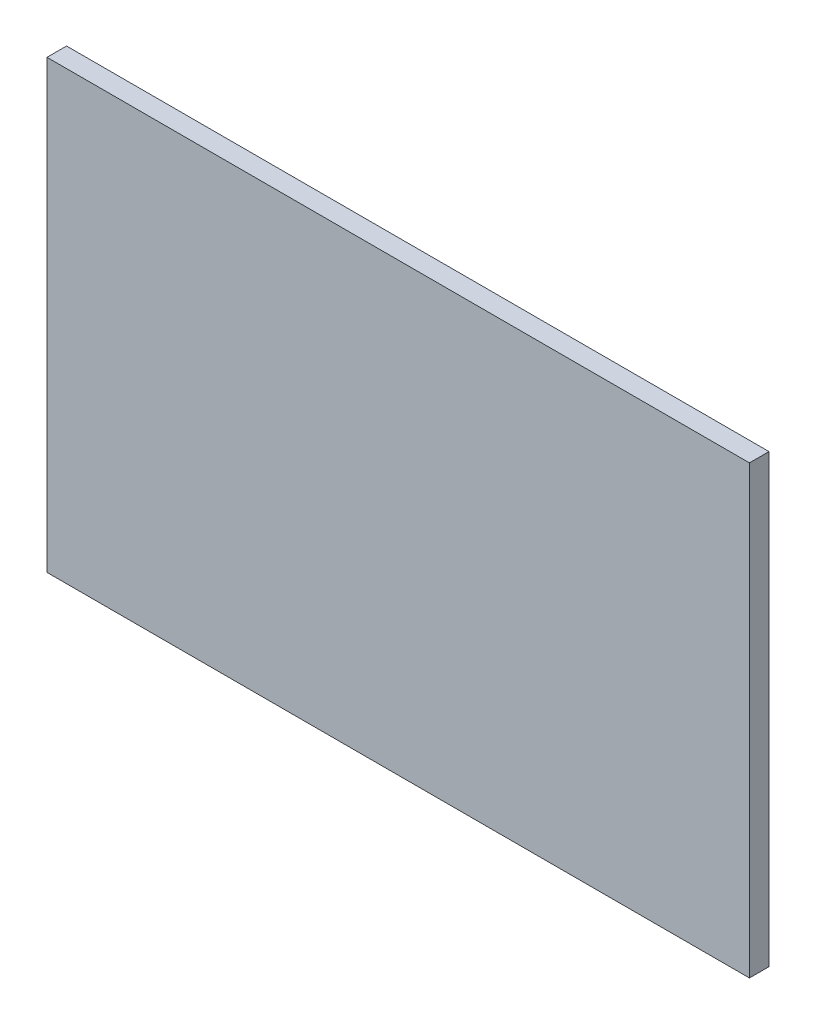
ISO-10303-21;
HEADER;
FILE_DESCRIPTION(('STEP AP214'),'2;1');
FILE_NAME('part.step','',(''),(''),'','','');
FILE_SCHEMA(('AUTOMOTIVE_DESIGN { 1 0 10303 214 1 1 1 1 }'));
ENDSEC;
DATA;
#1=APPLICATION_CONTEXT('core data for automotive mechanical design processes');
#2=APPLICATION_PROTOCOL_DEFINITION('international standard','automotive_design',2000,#1);
#3=PRODUCT_CONTEXT('',#1,'mechanical');
#4=PRODUCT('Part','Part','',(#3));
#5=PRODUCT_RELATED_PRODUCT_CATEGORY('part','',(#4));
#6=PRODUCT_DEFINITION_FORMATION('','',#4);
#7=PRODUCT_DEFINITION_CONTEXT('part definition',#1,'design');
#8=PRODUCT_DEFINITION('design','',#6,#7);
#9=PRODUCT_DEFINITION_SHAPE('','',#8);
#10=(LENGTH_UNIT() NAMED_UNIT(*) SI_UNIT(.MILLI.,.METRE.));
#11=(NAMED_UNIT(*) PLANE_ANGLE_UNIT() SI_UNIT($,.RADIAN.));
#12=(NAMED_UNIT(*) SI_UNIT($,.STERADIAN.) SOLID_ANGLE_UNIT());
#13=UNCERTAINTY_MEASURE_WITH_UNIT(LENGTH_MEASURE(1.E-05),#10,'distance_accuracy_value','');
#14=(GEOMETRIC_REPRESENTATION_CONTEXT(3) GLOBAL_UNCERTAINTY_ASSIGNED_CONTEXT((#13)) GLOBAL_UNIT_ASSIGNED_CONTEXT((#10,
#11,#12)) REPRESENTATION_CONTEXT('',''));
#15=CARTESIAN_POINT('',(0.,0.,0.));
#16=DIRECTION('',(0.,0.,1.));
#17=DIRECTION('',(1.,0.,0.));
#18=AXIS2_PLACEMENT_3D('',#15,#16,#17);
#19=CARTESIAN_POINT('',(179.5,-114.,10.));
#20=DIRECTION('',(-1.,0.,0.));
#21=DIRECTION('',(0.,0.,1.));
#22=AXIS2_PLACEMENT_3D('',#19,#20,#21);
#23=PLANE('',#22);
#24=DIRECTION('',(0.,1.,0.));
#25=VECTOR('',#24,1.);
#26=CARTESIAN_POINT('',(179.5,-114.,0.));
#27=LINE('',#26,#25);
#28=CARTESIAN_POINT('',(179.5,-114.,0.));
#29=VERTEX_POINT('',#28);
#30=CARTESIAN_POINT('',(179.5,114.,0.));
#31=VERTEX_POINT('',#30);
#32=EDGE_CURVE('E95',#29,#31,#27,.T.);
#33=ORIENTED_EDGE('',*,*,#32,.T.);
#34=DIRECTION('',(0.,0.,-1.));
#35=VECTOR('',#34,1.);
#36=CARTESIAN_POINT('',(179.5,114.,10.));
#37=LINE('',#36,#35);
#38=CARTESIAN_POINT('',(179.5,114.,10.));
#39=VERTEX_POINT('',#38);
#40=EDGE_CURVE('E11',#39,#31,#37,.T.);
#41=ORIENTED_EDGE('',*,*,#40,.F.);
#42=DIRECTION('',(0.,1.,0.));
#43=VECTOR('',#42,1.);
#44=CARTESIAN_POINT('',(179.5,-114.,10.));
#45=LINE('',#44,#43);
#46=CARTESIAN_POINT('',(179.5,-114.,10.));
#47=VERTEX_POINT('',#46);
#48=EDGE_CURVE('E83',#47,#39,#45,.T.);
#49=ORIENTED_EDGE('',*,*,#48,.F.);
#50=DIRECTION('',(0.,0.,-1.));
#51=VECTOR('',#50,1.);
#52=CARTESIAN_POINT('',(179.5,-114.,10.));
#53=LINE('',#52,#51);
#54=EDGE_CURVE('E91',#47,#29,#53,.T.);
#55=ORIENTED_EDGE('',*,*,#54,.T.);
#56=EDGE_LOOP('',(#33,#41,#49,#55));
#57=FACE_BOUND('',#56,.T.);
#58=ADVANCED_FACE('F32',(#57),#23,.F.);
#59=CARTESIAN_POINT('',(-179.5,114.,10.));
#60=DIRECTION('',(0.,-1.,0.));
#61=DIRECTION('',(0.,0.,-1.));
#62=AXIS2_PLACEMENT_3D('',#59,#60,#61);
#63=PLANE('',#62);
#64=DIRECTION('',(-1.,0.,0.));
#65=VECTOR('',#64,1.);
#66=CARTESIAN_POINT('',(-179.5,114.,0.));
#67=LINE('',#66,#65);
#68=CARTESIAN_POINT('',(-179.5,114.,0.));
#69=VERTEX_POINT('',#68);
#70=EDGE_CURVE('E87',#31,#69,#67,.T.);
#71=ORIENTED_EDGE('',*,*,#70,.T.);
#72=DIRECTION('',(0.,0.,-1.));
#73=VECTOR('',#72,1.);
#74=CARTESIAN_POINT('',(-179.5,114.,10.));
#75=LINE('',#74,#73);
#76=CARTESIAN_POINT('',(-179.5,114.,10.));
#77=VERTEX_POINT('',#76);
#78=EDGE_CURVE('E40',#77,#69,#75,.T.);
#79=ORIENTED_EDGE('',*,*,#78,.F.);
#80=DIRECTION('',(-1.,0.,0.));
#81=VECTOR('',#80,1.);
#82=CARTESIAN_POINT('',(-179.5,114.,10.));
#83=LINE('',#82,#81);
#84=EDGE_CURVE('E78',#39,#77,#83,.T.);
#85=ORIENTED_EDGE('',*,*,#84,.F.);
#86=ORIENTED_EDGE('',*,*,#40,.T.);
#87=EDGE_LOOP('',(#71,#79,#85,#86));
#88=FACE_BOUND('',#87,.T.);
#89=ADVANCED_FACE('F86',(#88),#63,.F.);
#90=CARTESIAN_POINT('',(-179.5,-114.,10.));
#91=DIRECTION('',(1.,0.,0.));
#92=DIRECTION('',(0.,0.,-1.));
#93=AXIS2_PLACEMENT_3D('',#90,#91,#92);
#94=PLANE('',#93);
#95=DIRECTION('',(0.,-1.,0.));
#96=VECTOR('',#95,1.);
#97=CARTESIAN_POINT('',(-179.5,-114.,0.));
#98=LINE('',#97,#96);
#99=CARTESIAN_POINT('',(-179.5,-114.,0.));
#100=VERTEX_POINT('',#99);
#101=EDGE_CURVE('E65',#69,#100,#98,.T.);
#102=ORIENTED_EDGE('',*,*,#101,.T.);
#103=DIRECTION('',(0.,0.,-1.));
#104=VECTOR('',#103,1.);
#105=CARTESIAN_POINT('',(-179.5,-114.,10.));
#106=LINE('',#105,#104);
#107=CARTESIAN_POINT('',(-179.5,-114.,10.));
#108=VERTEX_POINT('',#107);
#109=EDGE_CURVE('E88',#108,#100,#106,.T.);
#110=ORIENTED_EDGE('',*,*,#109,.F.);
#111=DIRECTION('',(0.,-1.,0.));
#112=VECTOR('',#111,1.);
#113=CARTESIAN_POINT('',(-179.5,-114.,10.));
#114=LINE('',#113,#112);
#115=EDGE_CURVE('E81',#77,#108,#114,.T.);
#116=ORIENTED_EDGE('',*,*,#115,.F.);
#117=ORIENTED_EDGE('',*,*,#78,.T.);
#118=EDGE_LOOP('',(#102,#110,#116,#117));
#119=FACE_BOUND('',#118,.T.);
#120=ADVANCED_FACE('F89',(#119),#94,.F.);
#121=CARTESIAN_POINT('',(-179.5,-114.,10.));
#122=DIRECTION('',(0.,1.,0.));
#123=DIRECTION('',(0.,0.,1.));
#124=AXIS2_PLACEMENT_3D('',#121,#122,#123);
#125=PLANE('',#124);
#126=DIRECTION('',(1.,0.,0.));
#127=VECTOR('',#126,1.);
#128=CARTESIAN_POINT('',(-179.5,-114.,0.));
#129=LINE('',#128,#127);
#130=EDGE_CURVE('E71',#100,#29,#129,.T.);
#131=ORIENTED_EDGE('',*,*,#130,.T.);
#132=ORIENTED_EDGE('',*,*,#54,.F.);
#133=DIRECTION('',(1.,0.,0.));
#134=VECTOR('',#133,1.);
#135=CARTESIAN_POINT('',(-179.5,-114.,10.));
#136=LINE('',#135,#134);
#137=EDGE_CURVE('E48',#108,#47,#136,.T.);
#138=ORIENTED_EDGE('',*,*,#137,.F.);
#139=ORIENTED_EDGE('',*,*,#109,.T.);
#140=EDGE_LOOP('',(#131,#132,#138,#139));
#141=FACE_BOUND('',#140,.T.);
#142=ADVANCED_FACE('F102',(#141),#125,.F.);
#143=CARTESIAN_POINT('',(0.,0.,10.));
#144=DIRECTION('',(0.,0.,-1.));
#145=DIRECTION('',(-1.,0.,0.));
#146=AXIS2_PLACEMENT_3D('',#143,#144,#145);
#147=PLANE('',#146);
#148=ORIENTED_EDGE('',*,*,#48,.T.);
#149=ORIENTED_EDGE('',*,*,#84,.T.);
#150=ORIENTED_EDGE('',*,*,#115,.T.);
#151=ORIENTED_EDGE('',*,*,#137,.T.);
#152=EDGE_LOOP('',(#148,#149,#150,#151));
#153=FACE_BOUND('',#152,.T.);
#154=ADVANCED_FACE('F79',(#153),#147,.F.);
#155=CARTESIAN_POINT('',(0.,0.,0.));
#156=DIRECTION('',(0.,0.,-1.));
#157=DIRECTION('',(-1.,0.,0.));
#158=AXIS2_PLACEMENT_3D('',#155,#156,#157);
#159=PLANE('',#158);
#160=ORIENTED_EDGE('',*,*,#32,.F.);
#161=ORIENTED_EDGE('',*,*,#130,.F.);
#162=ORIENTED_EDGE('',*,*,#101,.F.);
#163=ORIENTED_EDGE('',*,*,#70,.F.);
#164=EDGE_LOOP('',(#160,#161,#162,#163));
#165=FACE_BOUND('',#164,.T.);
#166=ADVANCED_FACE('F105',(#165),#159,.T.);
#167=CLOSED_SHELL('',(#58,#89,#120,#142,#154,#166));
#168=MANIFOLD_SOLID_BREP('B2',#167);
#169=ADVANCED_BREP_SHAPE_REPRESENTATION('',(#18,#168),#14);
#170=SHAPE_DEFINITION_REPRESENTATION(#9,#169);
ENDSEC;
END-ISO-10303-21;
